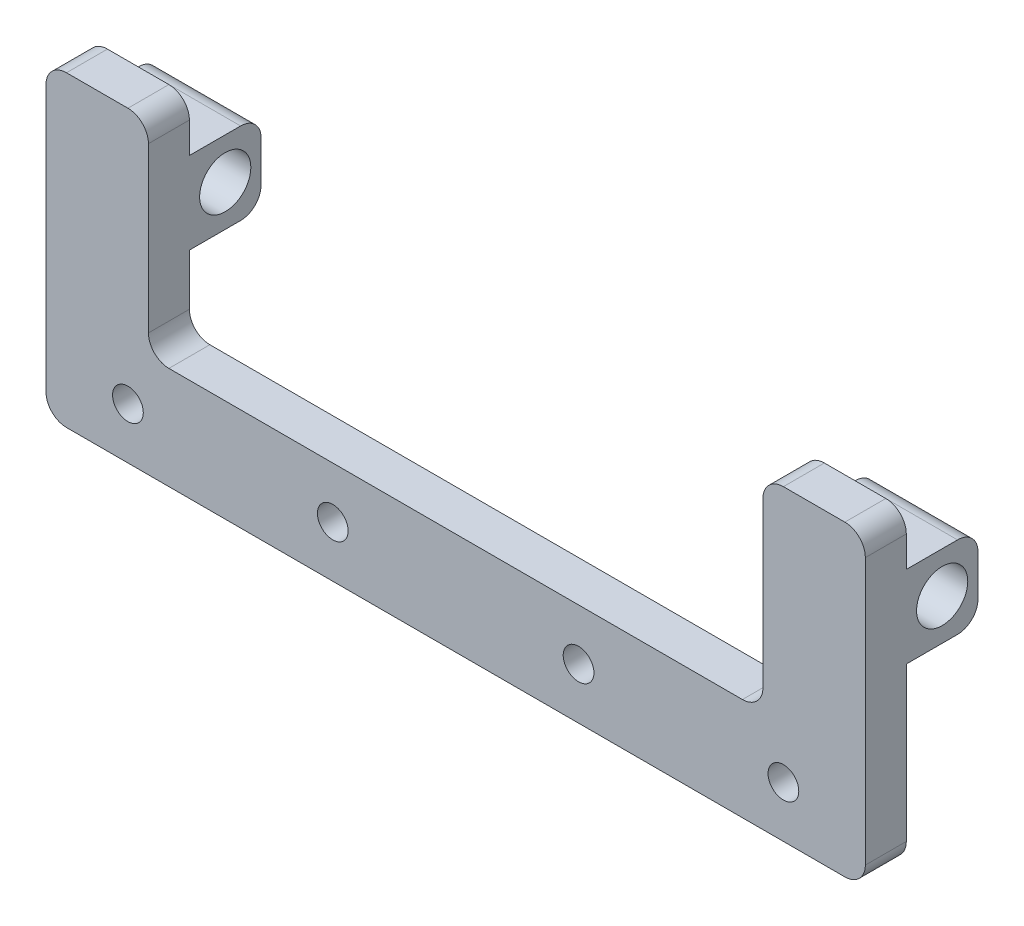
ISO-10303-21;
HEADER;
FILE_DESCRIPTION(('STEP AP214'),'2;1');
FILE_NAME('part.step','',(''),(''),'','','');
FILE_SCHEMA(('AUTOMOTIVE_DESIGN { 1 0 10303 214 1 1 1 1 }'));
ENDSEC;
DATA;
#1=APPLICATION_CONTEXT('core data for automotive mechanical design processes');
#2=APPLICATION_PROTOCOL_DEFINITION('international standard','automotive_design',2000,#1);
#3=PRODUCT_CONTEXT('',#1,'mechanical');
#4=PRODUCT('Part','Part','',(#3));
#5=PRODUCT_RELATED_PRODUCT_CATEGORY('part','',(#4));
#6=PRODUCT_DEFINITION_FORMATION('','',#4);
#7=PRODUCT_DEFINITION_CONTEXT('part definition',#1,'design');
#8=PRODUCT_DEFINITION('design','',#6,#7);
#9=PRODUCT_DEFINITION_SHAPE('','',#8);
#10=(LENGTH_UNIT() NAMED_UNIT(*) SI_UNIT(.MILLI.,.METRE.));
#11=(NAMED_UNIT(*) PLANE_ANGLE_UNIT() SI_UNIT($,.RADIAN.));
#12=(NAMED_UNIT(*) SI_UNIT($,.STERADIAN.) SOLID_ANGLE_UNIT());
#13=UNCERTAINTY_MEASURE_WITH_UNIT(LENGTH_MEASURE(1.E-05),#10,'distance_accuracy_value','');
#14=(GEOMETRIC_REPRESENTATION_CONTEXT(3) GLOBAL_UNCERTAINTY_ASSIGNED_CONTEXT((#13)) GLOBAL_UNIT_ASSIGNED_CONTEXT((#10,
#11,#12)) REPRESENTATION_CONTEXT('',''));
#15=CARTESIAN_POINT('',(0.,0.,0.));
#16=DIRECTION('',(0.,0.,1.));
#17=DIRECTION('',(1.,0.,0.));
#18=AXIS2_PLACEMENT_3D('',#15,#16,#17);
#19=CARTESIAN_POINT('',(0.,0.,0.));
#20=DIRECTION('',(0.,0.,-1.));
#21=DIRECTION('',(-1.,0.,0.));
#22=AXIS2_PLACEMENT_3D('',#19,#20,#21);
#23=PLANE('',#22);
#24=CARTESIAN_POINT('',(38.,18.,0.));
#25=DIRECTION('',(0.,0.,-1.));
#26=DIRECTION('',(-1.,0.,0.));
#27=AXIS2_PLACEMENT_3D('',#24,#25,#26);
#28=CIRCLE('',#27,2.);
#29=CARTESIAN_POINT('',(38.,20.,0.));
#30=VERTEX_POINT('',#29);
#31=CARTESIAN_POINT('',(40.,18.,0.));
#32=VERTEX_POINT('',#31);
#33=EDGE_CURVE('E333',#30,#32,#28,.T.);
#34=ORIENTED_EDGE('',*,*,#33,.T.);
#35=DIRECTION('',(0.,1.,0.));
#36=VECTOR('',#35,1.);
#37=CARTESIAN_POINT('',(40.,0.,0.));
#38=LINE('',#37,#36);
#39=CARTESIAN_POINT('',(40.,15.,0.));
#40=VERTEX_POINT('',#39);
#41=EDGE_CURVE('E211',#32,#40,#38,.F.);
#42=ORIENTED_EDGE('',*,*,#41,.T.);
#43=DIRECTION('',(1.,0.,0.));
#44=VECTOR('',#43,1.);
#45=CARTESIAN_POINT('',(0.,15.,0.));
#46=LINE('',#45,#44);
#47=CARTESIAN_POINT('',(30.,15.,0.));
#48=VERTEX_POINT('',#47);
#49=EDGE_CURVE('E205',#40,#48,#46,.F.);
#50=ORIENTED_EDGE('',*,*,#49,.T.);
#51=DIRECTION('',(0.,1.,0.));
#52=VECTOR('',#51,1.);
#53=CARTESIAN_POINT('',(30.,0.,0.));
#54=LINE('',#53,#52);
#55=CARTESIAN_POINT('',(30.,18.,0.));
#56=VERTEX_POINT('',#55);
#57=EDGE_CURVE('E208',#48,#56,#54,.T.);
#58=ORIENTED_EDGE('',*,*,#57,.T.);
#59=CARTESIAN_POINT('',(32.,18.,0.));
#60=DIRECTION('',(0.,0.,-1.));
#61=DIRECTION('',(-1.,0.,0.));
#62=AXIS2_PLACEMENT_3D('',#59,#60,#61);
#63=CIRCLE('',#62,2.);
#64=CARTESIAN_POINT('',(32.,20.,0.));
#65=VERTEX_POINT('',#64);
#66=EDGE_CURVE('E337',#56,#65,#63,.T.);
#67=ORIENTED_EDGE('',*,*,#66,.T.);
#68=DIRECTION('',(1.,0.,0.));
#69=VECTOR('',#68,1.);
#70=CARTESIAN_POINT('',(0.,20.,0.));
#71=LINE('',#70,#69);
#72=EDGE_CURVE('E235',#65,#30,#71,.T.);
#73=ORIENTED_EDGE('',*,*,#72,.T.);
#74=EDGE_LOOP('',(#34,#42,#50,#58,#67,#73));
#75=FACE_BOUND('',#74,.T.);
#76=ADVANCED_FACE('F17',(#75),#23,.T.);
#77=CARTESIAN_POINT('',(0.,15.,0.));
#78=DIRECTION('',(0.,1.,0.));
#79=DIRECTION('',(0.,0.,1.));
#80=AXIS2_PLACEMENT_3D('',#77,#78,#79);
#81=PLANE('',#80);
#82=ORIENTED_EDGE('',*,*,#49,.F.);
#83=DIRECTION('',(0.,0.,-1.));
#84=VECTOR('',#83,1.);
#85=CARTESIAN_POINT('',(40.,15.,0.));
#86=LINE('',#85,#84);
#87=CARTESIAN_POINT('',(40.,15.,-5.));
#88=VERTEX_POINT('',#87);
#89=EDGE_CURVE('E332',#40,#88,#86,.T.);
#90=ORIENTED_EDGE('',*,*,#89,.T.);
#91=DIRECTION('',(-1.,0.,0.));
#92=VECTOR('',#91,1.);
#93=CARTESIAN_POINT('',(35.,15.,-5.));
#94=LINE('',#93,#92);
#95=CARTESIAN_POINT('',(30.,15.,-4.99999999999999));
#96=VERTEX_POINT('',#95);
#97=EDGE_CURVE('E214',#88,#96,#94,.T.);
#98=ORIENTED_EDGE('',*,*,#97,.T.);
#99=DIRECTION('',(0.,0.,1.));
#100=VECTOR('',#99,1.);
#101=CARTESIAN_POINT('',(30.,15.,0.));
#102=LINE('',#101,#100);
#103=EDGE_CURVE('E217',#96,#48,#102,.T.);
#104=ORIENTED_EDGE('',*,*,#103,.T.);
#105=EDGE_LOOP('',(#82,#90,#98,#104));
#106=FACE_BOUND('',#105,.T.);
#107=ADVANCED_FACE('F218',(#106),#81,.T.);
#108=CARTESIAN_POINT('',(40.,13.,-5.));
#109=DIRECTION('',(-1.,0.,0.));
#110=DIRECTION('',(0.,0.,1.));
#111=AXIS2_PLACEMENT_3D('',#108,#109,#110);
#112=CYLINDRICAL_SURFACE('',#111,2.);
#113=CARTESIAN_POINT('',(40.,13.,-5.));
#114=DIRECTION('',(-1.,0.,0.));
#115=DIRECTION('',(0.,0.,1.));
#116=AXIS2_PLACEMENT_3D('',#113,#114,#115);
#117=CIRCLE('',#116,2.);
#118=CARTESIAN_POINT('',(40.,13.,-7.));
#119=VERTEX_POINT('',#118);
#120=EDGE_CURVE('E330',#88,#119,#117,.T.);
#121=ORIENTED_EDGE('',*,*,#120,.T.);
#122=DIRECTION('',(1.,0.,0.));
#123=VECTOR('',#122,1.);
#124=CARTESIAN_POINT('',(0.,13.,-7.));
#125=LINE('',#124,#123);
#126=CARTESIAN_POINT('',(30.,13.,-7.));
#127=VERTEX_POINT('',#126);
#128=EDGE_CURVE('E400',#119,#127,#125,.F.);
#129=ORIENTED_EDGE('',*,*,#128,.T.);
#130=CARTESIAN_POINT('',(30.,13.,-4.99999999999998));
#131=DIRECTION('',(-1.,0.,0.));
#132=DIRECTION('',(0.,0.,1.));
#133=AXIS2_PLACEMENT_3D('',#130,#131,#132);
#134=CIRCLE('',#133,2.);
#135=EDGE_CURVE('E223',#127,#96,#134,.F.);
#136=ORIENTED_EDGE('',*,*,#135,.T.);
#137=ORIENTED_EDGE('',*,*,#97,.F.);
#138=EDGE_LOOP('',(#121,#129,#136,#137));
#139=FACE_BOUND('',#138,.T.);
#140=ADVANCED_FACE('F510',(#139),#112,.T.);
#141=CARTESIAN_POINT('',(0.,0.,-7.));
#142=DIRECTION('',(0.,0.,1.));
#143=DIRECTION('',(1.,0.,0.));
#144=AXIS2_PLACEMENT_3D('',#141,#142,#143);
#145=PLANE('',#144);
#146=DIRECTION('',(0.,1.,0.));
#147=VECTOR('',#146,1.);
#148=CARTESIAN_POINT('',(40.,0.,-7.));
#149=LINE('',#148,#147);
#150=CARTESIAN_POINT('',(40.,9.,-7.));
#151=VERTEX_POINT('',#150);
#152=EDGE_CURVE('E329',#119,#151,#149,.F.);
#153=ORIENTED_EDGE('',*,*,#152,.T.);
#154=DIRECTION('',(-1.,0.,0.));
#155=VECTOR('',#154,1.);
#156=CARTESIAN_POINT('',(35.,9.,-7.));
#157=LINE('',#156,#155);
#158=CARTESIAN_POINT('',(30.,9.,-7.));
#159=VERTEX_POINT('',#158);
#160=EDGE_CURVE('E396',#151,#159,#157,.T.);
#161=ORIENTED_EDGE('',*,*,#160,.T.);
#162=DIRECTION('',(0.,1.,0.));
#163=VECTOR('',#162,1.);
#164=CARTESIAN_POINT('',(30.,0.,-7.));
#165=LINE('',#164,#163);
#166=EDGE_CURVE('E341',#159,#127,#165,.T.);
#167=ORIENTED_EDGE('',*,*,#166,.T.);
#168=ORIENTED_EDGE('',*,*,#128,.F.);
#169=EDGE_LOOP('',(#153,#161,#167,#168));
#170=FACE_BOUND('',#169,.T.);
#171=ADVANCED_FACE('F489',(#170),#145,.F.);
#172=CARTESIAN_POINT('',(30.,9.,-5.));
#173=DIRECTION('',(1.,0.,0.));
#174=DIRECTION('',(0.,0.,-1.));
#175=AXIS2_PLACEMENT_3D('',#172,#173,#174);
#176=CYLINDRICAL_SURFACE('',#175,2.);
#177=CARTESIAN_POINT('',(30.,9.,-5.));
#178=DIRECTION('',(1.,0.,0.));
#179=DIRECTION('',(0.,0.,-1.));
#180=AXIS2_PLACEMENT_3D('',#177,#178,#179);
#181=CIRCLE('',#180,2.);
#182=CARTESIAN_POINT('',(30.,7.,-5.));
#183=VERTEX_POINT('',#182);
#184=EDGE_CURVE('E342',#183,#159,#181,.T.);
#185=ORIENTED_EDGE('',*,*,#184,.T.);
#186=ORIENTED_EDGE('',*,*,#160,.F.);
#187=CARTESIAN_POINT('',(40.,9.,-5.00000000000001));
#188=DIRECTION('',(1.,0.,0.));
#189=DIRECTION('',(0.,0.,-1.));
#190=AXIS2_PLACEMENT_3D('',#187,#188,#189);
#191=CIRCLE('',#190,2.);
#192=CARTESIAN_POINT('',(40.,7.,-5.));
#193=VERTEX_POINT('',#192);
#194=EDGE_CURVE('E327',#151,#193,#191,.F.);
#195=ORIENTED_EDGE('',*,*,#194,.T.);
#196=DIRECTION('',(1.,0.,0.));
#197=VECTOR('',#196,1.);
#198=CARTESIAN_POINT('',(0.,7.,-5.));
#199=LINE('',#198,#197);
#200=EDGE_CURVE('E382',#193,#183,#199,.F.);
#201=ORIENTED_EDGE('',*,*,#200,.T.);
#202=EDGE_LOOP('',(#185,#186,#195,#201));
#203=FACE_BOUND('',#202,.T.);
#204=ADVANCED_FACE('F494',(#203),#176,.T.);
#205=CARTESIAN_POINT('',(30.,11.,-3.5));
#206=DIRECTION('',(1.,0.,0.));
#207=DIRECTION('',(0.,0.,-1.));
#208=AXIS2_PLACEMENT_3D('',#205,#206,#207);
#209=CYLINDRICAL_SURFACE('',#208,2.50000000047519);
#210=CARTESIAN_POINT('',(40.,11.,-3.50000000000001));
#211=DIRECTION('',(1.,0.,0.));
#212=DIRECTION('',(0.,0.,-1.));
#213=AXIS2_PLACEMENT_3D('',#210,#211,#212);
#214=CIRCLE('',#213,2.50000000047519);
#215=CARTESIAN_POINT('',(40.,11.,-6.0000000004752));
#216=VERTEX_POINT('',#215);
#217=EDGE_CURVE('E322',#216,#216,#214,.T.);
#218=ORIENTED_EDGE('',*,*,#217,.T.);
#219=EDGE_LOOP('',(#218));
#220=FACE_BOUND('',#219,.T.);
#221=CARTESIAN_POINT('',(30.,11.,-3.5));
#222=DIRECTION('',(1.,0.,0.));
#223=DIRECTION('',(0.,0.,-1.));
#224=AXIS2_PLACEMENT_3D('',#221,#222,#223);
#225=CIRCLE('',#224,2.50000000047519);
#226=CARTESIAN_POINT('',(30.,11.,-6.00000000047519));
#227=VERTEX_POINT('',#226);
#228=EDGE_CURVE('E229',#227,#227,#225,.F.);
#229=ORIENTED_EDGE('',*,*,#228,.T.);
#230=EDGE_LOOP('',(#229));
#231=FACE_BOUND('',#230,.T.);
#232=ADVANCED_FACE('F638',(#220,#231),#209,.F.);
#233=CARTESIAN_POINT('',(-30.,9.,-5.));
#234=DIRECTION('',(-1.,0.,0.));
#235=DIRECTION('',(0.,-1.,0.));
#236=AXIS2_PLACEMENT_3D('',#233,#234,#235);
#237=CYLINDRICAL_SURFACE('',#236,2.);
#238=CARTESIAN_POINT('',(-30.,9.,-5.));
#239=DIRECTION('',(-1.,0.,0.));
#240=DIRECTION('',(0.,-1.,0.));
#241=AXIS2_PLACEMENT_3D('',#238,#239,#240);
#242=CIRCLE('',#241,2.);
#243=CARTESIAN_POINT('',(-30.,9.,-7.));
#244=VERTEX_POINT('',#243);
#245=CARTESIAN_POINT('',(-30.,7.,-5.));
#246=VERTEX_POINT('',#245);
#247=EDGE_CURVE('E351',#244,#246,#242,.T.);
#248=ORIENTED_EDGE('',*,*,#247,.T.);
#249=DIRECTION('',(1.,0.,0.));
#250=VECTOR('',#249,1.);
#251=CARTESIAN_POINT('',(0.,7.,-5.));
#252=LINE('',#251,#250);
#253=CARTESIAN_POINT('',(-40.,7.,-5.));
#254=VERTEX_POINT('',#253);
#255=EDGE_CURVE('E387',#246,#254,#252,.F.);
#256=ORIENTED_EDGE('',*,*,#255,.T.);
#257=CARTESIAN_POINT('',(-40.,8.99999999999999,-5.));
#258=DIRECTION('',(-1.,0.,0.));
#259=DIRECTION('',(0.,-1.,0.));
#260=AXIS2_PLACEMENT_3D('',#257,#258,#259);
#261=CIRCLE('',#260,2.);
#262=CARTESIAN_POINT('',(-40.,9.,-7.));
#263=VERTEX_POINT('',#262);
#264=EDGE_CURVE('E319',#254,#263,#261,.F.);
#265=ORIENTED_EDGE('',*,*,#264,.T.);
#266=DIRECTION('',(1.,0.,0.));
#267=VECTOR('',#266,1.);
#268=CARTESIAN_POINT('',(0.,9.,-7.));
#269=LINE('',#268,#267);
#270=EDGE_CURVE('E394',#263,#244,#269,.T.);
#271=ORIENTED_EDGE('',*,*,#270,.T.);
#272=EDGE_LOOP('',(#248,#256,#265,#271));
#273=FACE_BOUND('',#272,.T.);
#274=ADVANCED_FACE('F636',(#273),#237,.T.);
#275=CARTESIAN_POINT('',(0.,0.,-7.));
#276=DIRECTION('',(0.,0.,1.));
#277=DIRECTION('',(1.,0.,0.));
#278=AXIS2_PLACEMENT_3D('',#275,#276,#277);
#279=PLANE('',#278);
#280=DIRECTION('',(0.,1.,0.));
#281=VECTOR('',#280,1.);
#282=CARTESIAN_POINT('',(-40.,0.,-7.));
#283=LINE('',#282,#281);
#284=CARTESIAN_POINT('',(-40.,13.,-7.));
#285=VERTEX_POINT('',#284);
#286=EDGE_CURVE('E318',#263,#285,#283,.T.);
#287=ORIENTED_EDGE('',*,*,#286,.T.);
#288=DIRECTION('',(1.,0.,0.));
#289=VECTOR('',#288,1.);
#290=CARTESIAN_POINT('',(-35.,13.,-7.));
#291=LINE('',#290,#289);
#292=CARTESIAN_POINT('',(-30.,13.,-7.));
#293=VERTEX_POINT('',#292);
#294=EDGE_CURVE('E392',#285,#293,#291,.T.);
#295=ORIENTED_EDGE('',*,*,#294,.T.);
#296=DIRECTION('',(0.,1.,0.));
#297=VECTOR('',#296,1.);
#298=CARTESIAN_POINT('',(-30.,0.,-7.));
#299=LINE('',#298,#297);
#300=EDGE_CURVE('E352',#293,#244,#299,.F.);
#301=ORIENTED_EDGE('',*,*,#300,.T.);
#302=ORIENTED_EDGE('',*,*,#270,.F.);
#303=EDGE_LOOP('',(#287,#295,#301,#302));
#304=FACE_BOUND('',#303,.T.);
#305=ADVANCED_FACE('F631',(#304),#279,.F.);
#306=CARTESIAN_POINT('',(-40.,13.,-5.));
#307=DIRECTION('',(1.,0.,0.));
#308=DIRECTION('',(0.,1.,0.));
#309=AXIS2_PLACEMENT_3D('',#306,#307,#308);
#310=CYLINDRICAL_SURFACE('',#309,2.);
#311=CARTESIAN_POINT('',(-40.,13.,-5.));
#312=DIRECTION('',(1.,0.,0.));
#313=DIRECTION('',(0.,1.,0.));
#314=AXIS2_PLACEMENT_3D('',#311,#312,#313);
#315=CIRCLE('',#314,2.);
#316=CARTESIAN_POINT('',(-40.,15.,-5.));
#317=VERTEX_POINT('',#316);
#318=EDGE_CURVE('E315',#285,#317,#315,.T.);
#319=ORIENTED_EDGE('',*,*,#318,.T.);
#320=DIRECTION('',(1.,0.,0.));
#321=VECTOR('',#320,1.);
#322=CARTESIAN_POINT('',(0.,15.,-5.));
#323=LINE('',#322,#321);
#324=CARTESIAN_POINT('',(-30.,15.,-5.));
#325=VERTEX_POINT('',#324);
#326=EDGE_CURVE('E388',#317,#325,#323,.T.);
#327=ORIENTED_EDGE('',*,*,#326,.T.);
#328=CARTESIAN_POINT('',(-30.,13.,-5.));
#329=DIRECTION('',(1.,0.,0.));
#330=DIRECTION('',(0.,1.,0.));
#331=AXIS2_PLACEMENT_3D('',#328,#329,#330);
#332=CIRCLE('',#331,2.);
#333=EDGE_CURVE('E353',#325,#293,#332,.F.);
#334=ORIENTED_EDGE('',*,*,#333,.T.);
#335=ORIENTED_EDGE('',*,*,#294,.F.);
#336=EDGE_LOOP('',(#319,#327,#334,#335));
#337=FACE_BOUND('',#336,.T.);
#338=ADVANCED_FACE('F633',(#337),#310,.T.);
#339=CARTESIAN_POINT('',(0.,15.,0.));
#340=DIRECTION('',(0.,1.,0.));
#341=DIRECTION('',(0.,0.,1.));
#342=AXIS2_PLACEMENT_3D('',#339,#340,#341);
#343=PLANE('',#342);
#344=DIRECTION('',(-1.,0.,0.));
#345=VECTOR('',#344,1.);
#346=CARTESIAN_POINT('',(0.,15.,0.));
#347=LINE('',#346,#345);
#348=CARTESIAN_POINT('',(-40.,15.,0.));
#349=VERTEX_POINT('',#348);
#350=CARTESIAN_POINT('',(-30.,15.,0.));
#351=VERTEX_POINT('',#350);
#352=EDGE_CURVE('E197',#349,#351,#347,.F.);
#353=ORIENTED_EDGE('',*,*,#352,.T.);
#354=DIRECTION('',(0.,0.,-1.));
#355=VECTOR('',#354,1.);
#356=CARTESIAN_POINT('',(-30.,15.,0.));
#357=LINE('',#356,#355);
#358=EDGE_CURVE('E241',#351,#325,#357,.T.);
#359=ORIENTED_EDGE('',*,*,#358,.T.);
#360=ORIENTED_EDGE('',*,*,#326,.F.);
#361=DIRECTION('',(0.,0.,1.));
#362=VECTOR('',#361,1.);
#363=CARTESIAN_POINT('',(-40.,15.,0.));
#364=LINE('',#363,#362);
#365=EDGE_CURVE('E317',#317,#349,#364,.T.);
#366=ORIENTED_EDGE('',*,*,#365,.T.);
#367=EDGE_LOOP('',(#353,#359,#360,#366));
#368=FACE_BOUND('',#367,.T.);
#369=ADVANCED_FACE('F712',(#368),#343,.T.);
#370=CARTESIAN_POINT('',(-40.,11.,-3.5));
#371=DIRECTION('',(1.,0.,0.));
#372=DIRECTION('',(0.,0.,-1.));
#373=AXIS2_PLACEMENT_3D('',#370,#371,#372);
#374=CYLINDRICAL_SURFACE('',#373,2.50000000047519);
#375=CARTESIAN_POINT('',(-40.,11.,-3.5));
#376=DIRECTION('',(1.,0.,0.));
#377=DIRECTION('',(0.,0.,-1.));
#378=AXIS2_PLACEMENT_3D('',#375,#376,#377);
#379=CIRCLE('',#378,2.50000000047519);
#380=CARTESIAN_POINT('',(-40.,11.,-6.00000000047519));
#381=VERTEX_POINT('',#380);
#382=EDGE_CURVE('E311',#381,#381,#379,.F.);
#383=ORIENTED_EDGE('',*,*,#382,.T.);
#384=EDGE_LOOP('',(#383));
#385=FACE_BOUND('',#384,.T.);
#386=CARTESIAN_POINT('',(-30.,11.,-3.49999999999999));
#387=DIRECTION('',(1.,0.,0.));
#388=DIRECTION('',(0.,0.,-1.));
#389=AXIS2_PLACEMENT_3D('',#386,#387,#388);
#390=CIRCLE('',#389,2.50000000047519);
#391=CARTESIAN_POINT('',(-30.,11.,-6.00000000047518));
#392=VERTEX_POINT('',#391);
#393=EDGE_CURVE('E346',#392,#392,#390,.T.);
#394=ORIENTED_EDGE('',*,*,#393,.T.);
#395=EDGE_LOOP('',(#394));
#396=FACE_BOUND('',#395,.T.);
#397=ADVANCED_FACE('F720',(#385,#396),#374,.F.);
#398=CARTESIAN_POINT('',(0.,0.,0.));
#399=DIRECTION('',(0.,0.,-1.));
#400=DIRECTION('',(-1.,0.,0.));
#401=AXIS2_PLACEMENT_3D('',#398,#399,#400);
#402=PLANE('',#401);
#403=CARTESIAN_POINT('',(-32.,18.,0.));
#404=DIRECTION('',(0.,0.,-1.));
#405=DIRECTION('',(-1.,0.,0.));
#406=AXIS2_PLACEMENT_3D('',#403,#404,#405);
#407=CIRCLE('',#406,2.);
#408=CARTESIAN_POINT('',(-32.,20.,0.));
#409=VERTEX_POINT('',#408);
#410=CARTESIAN_POINT('',(-30.,18.,0.));
#411=VERTEX_POINT('',#410);
#412=EDGE_CURVE('E20',#409,#411,#407,.T.);
#413=ORIENTED_EDGE('',*,*,#412,.T.);
#414=DIRECTION('',(0.,1.,0.));
#415=VECTOR('',#414,1.);
#416=CARTESIAN_POINT('',(-30.,0.,0.));
#417=LINE('',#416,#415);
#418=EDGE_CURVE('E239',#411,#351,#417,.F.);
#419=ORIENTED_EDGE('',*,*,#418,.T.);
#420=ORIENTED_EDGE('',*,*,#352,.F.);
#421=DIRECTION('',(0.,1.,0.));
#422=VECTOR('',#421,1.);
#423=CARTESIAN_POINT('',(-40.,0.,0.));
#424=LINE('',#423,#422);
#425=CARTESIAN_POINT('',(-40.,18.,0.));
#426=VERTEX_POINT('',#425);
#427=EDGE_CURVE('E314',#349,#426,#424,.T.);
#428=ORIENTED_EDGE('',*,*,#427,.T.);
#429=CARTESIAN_POINT('',(-38.,18.,0.));
#430=DIRECTION('',(0.,0.,-1.));
#431=DIRECTION('',(-1.,0.,0.));
#432=AXIS2_PLACEMENT_3D('',#429,#430,#431);
#433=CIRCLE('',#432,2.);
#434=CARTESIAN_POINT('',(-38.,20.,0.));
#435=VERTEX_POINT('',#434);
#436=EDGE_CURVE('E307',#426,#435,#433,.T.);
#437=ORIENTED_EDGE('',*,*,#436,.T.);
#438=DIRECTION('',(1.,0.,0.));
#439=VECTOR('',#438,1.);
#440=CARTESIAN_POINT('',(0.,20.,0.));
#441=LINE('',#440,#439);
#442=EDGE_CURVE('E186',#435,#409,#441,.T.);
#443=ORIENTED_EDGE('',*,*,#442,.T.);
#444=EDGE_LOOP('',(#413,#419,#420,#428,#437,#443));
#445=FACE_BOUND('',#444,.T.);
#446=ADVANCED_FACE('F626',(#445),#402,.T.);
#447=CARTESIAN_POINT('',(0.,7.,0.));
#448=DIRECTION('',(0.,-1.,0.));
#449=DIRECTION('',(0.,0.,-1.));
#450=AXIS2_PLACEMENT_3D('',#447,#448,#449);
#451=PLANE('',#450);
#452=DIRECTION('',(-1.,0.,0.));
#453=VECTOR('',#452,1.);
#454=CARTESIAN_POINT('',(0.,7.,0.));
#455=LINE('',#454,#453);
#456=CARTESIAN_POINT('',(-30.,7.,0.));
#457=VERTEX_POINT('',#456);
#458=CARTESIAN_POINT('',(-40.,7.,0.));
#459=VERTEX_POINT('',#458);
#460=EDGE_CURVE('E371',#457,#459,#455,.T.);
#461=ORIENTED_EDGE('',*,*,#460,.T.);
#462=DIRECTION('',(0.,0.,1.));
#463=VECTOR('',#462,1.);
#464=CARTESIAN_POINT('',(-40.,7.,0.));
#465=LINE('',#464,#463);
#466=EDGE_CURVE('E321',#459,#254,#465,.F.);
#467=ORIENTED_EDGE('',*,*,#466,.T.);
#468=ORIENTED_EDGE('',*,*,#255,.F.);
#469=DIRECTION('',(0.,0.,-1.));
#470=VECTOR('',#469,1.);
#471=CARTESIAN_POINT('',(-30.,7.,0.));
#472=LINE('',#471,#470);
#473=EDGE_CURVE('E350',#246,#457,#472,.F.);
#474=ORIENTED_EDGE('',*,*,#473,.T.);
#475=EDGE_LOOP('',(#461,#467,#468,#474));
#476=FACE_BOUND('',#475,.T.);
#477=ADVANCED_FACE('F441',(#476),#451,.T.);
#478=CARTESIAN_POINT('',(0.,7.,0.));
#479=DIRECTION('',(0.,-1.,0.));
#480=DIRECTION('',(0.,0.,-1.));
#481=AXIS2_PLACEMENT_3D('',#478,#479,#480);
#482=PLANE('',#481);
#483=DIRECTION('',(-1.,0.,0.));
#484=VECTOR('',#483,1.);
#485=CARTESIAN_POINT('',(0.,7.,0.));
#486=LINE('',#485,#484);
#487=CARTESIAN_POINT('',(40.,7.,0.));
#488=VERTEX_POINT('',#487);
#489=CARTESIAN_POINT('',(30.,7.,0.));
#490=VERTEX_POINT('',#489);
#491=EDGE_CURVE('E376',#488,#490,#486,.T.);
#492=ORIENTED_EDGE('',*,*,#491,.T.);
#493=DIRECTION('',(0.,0.,1.));
#494=VECTOR('',#493,1.);
#495=CARTESIAN_POINT('',(30.,7.,0.));
#496=LINE('',#495,#494);
#497=EDGE_CURVE('E345',#490,#183,#496,.F.);
#498=ORIENTED_EDGE('',*,*,#497,.T.);
#499=ORIENTED_EDGE('',*,*,#200,.F.);
#500=DIRECTION('',(0.,0.,-1.));
#501=VECTOR('',#500,1.);
#502=CARTESIAN_POINT('',(40.,7.,0.));
#503=LINE('',#502,#501);
#504=EDGE_CURVE('E326',#193,#488,#503,.F.);
#505=ORIENTED_EDGE('',*,*,#504,.T.);
#506=EDGE_LOOP('',(#492,#498,#499,#505));
#507=FACE_BOUND('',#506,.T.);
#508=ADVANCED_FACE('F504',(#507),#482,.T.);
#509=CARTESIAN_POINT('',(0.,20.,0.));
#510=DIRECTION('',(0.,1.,0.));
#511=DIRECTION('',(0.,0.,1.));
#512=AXIS2_PLACEMENT_3D('',#509,#510,#511);
#513=PLANE('',#512);
#514=DIRECTION('',(0.,0.,-1.));
#515=VECTOR('',#514,1.);
#516=CARTESIAN_POINT('',(-32.,20.,2.));
#517=LINE('',#516,#515);
#518=CARTESIAN_POINT('',(-32.,20.,4.));
#519=VERTEX_POINT('',#518);
#520=EDGE_CURVE('E369',#519,#409,#517,.T.);
#521=ORIENTED_EDGE('',*,*,#520,.T.);
#522=ORIENTED_EDGE('',*,*,#442,.F.);
#523=DIRECTION('',(0.,0.,1.));
#524=VECTOR('',#523,1.);
#525=CARTESIAN_POINT('',(-38.,20.,2.));
#526=LINE('',#525,#524);
#527=CARTESIAN_POINT('',(-38.,20.,4.));
#528=VERTEX_POINT('',#527);
#529=EDGE_CURVE('E309',#435,#528,#526,.T.);
#530=ORIENTED_EDGE('',*,*,#529,.T.);
#531=DIRECTION('',(-1.,0.,0.));
#532=VECTOR('',#531,1.);
#533=CARTESIAN_POINT('',(0.,20.,4.));
#534=LINE('',#533,#532);
#535=EDGE_CURVE('E279',#528,#519,#534,.F.);
#536=ORIENTED_EDGE('',*,*,#535,.T.);
#537=EDGE_LOOP('',(#521,#522,#530,#536));
#538=FACE_BOUND('',#537,.T.);
#539=ADVANCED_FACE('F754',(#538),#513,.T.);
#540=CARTESIAN_POINT('',(-32.,18.,4.));
#541=DIRECTION('',(0.,0.,-1.));
#542=DIRECTION('',(-1.,0.,0.));
#543=AXIS2_PLACEMENT_3D('',#540,#541,#542);
#544=CYLINDRICAL_SURFACE('',#543,2.);
#545=ORIENTED_EDGE('',*,*,#412,.F.);
#546=ORIENTED_EDGE('',*,*,#520,.F.);
#547=CARTESIAN_POINT('',(-32.,18.,4.));
#548=DIRECTION('',(0.,0.,-1.));
#549=DIRECTION('',(-1.,0.,0.));
#550=AXIS2_PLACEMENT_3D('',#547,#548,#549);
#551=CIRCLE('',#550,2.);
#552=CARTESIAN_POINT('',(-30.,18.,4.));
#553=VERTEX_POINT('',#552);
#554=EDGE_CURVE('E277',#519,#553,#551,.T.);
#555=ORIENTED_EDGE('',*,*,#554,.T.);
#556=DIRECTION('',(0.,0.,-1.));
#557=VECTOR('',#556,1.);
#558=CARTESIAN_POINT('',(-30.,18.,0.));
#559=LINE('',#558,#557);
#560=EDGE_CURVE('E242',#553,#411,#559,.T.);
#561=ORIENTED_EDGE('',*,*,#560,.T.);
#562=EDGE_LOOP('',(#545,#546,#555,#561));
#563=FACE_BOUND('',#562,.T.);
#564=ADVANCED_FACE('F763',(#563),#544,.T.);
#565=CARTESIAN_POINT('',(-30.,0.,0.));
#566=DIRECTION('',(1.,0.,0.));
#567=DIRECTION('',(0.,0.,-1.));
#568=AXIS2_PLACEMENT_3D('',#565,#566,#567);
#569=PLANE('',#568);
#570=ORIENTED_EDGE('',*,*,#393,.F.);
#571=EDGE_LOOP('',(#570));
#572=FACE_BOUND('',#571,.T.);
#573=DIRECTION('',(0.,0.,1.));
#574=VECTOR('',#573,1.);
#575=CARTESIAN_POINT('',(-30.,2.,2.));
#576=LINE('',#575,#574);
#577=CARTESIAN_POINT('',(-30.,2.,4.));
#578=VERTEX_POINT('',#577);
#579=CARTESIAN_POINT('',(-30.,2.,0.));
#580=VERTEX_POINT('',#579);
#581=EDGE_CURVE('E349',#578,#580,#576,.F.);
#582=ORIENTED_EDGE('',*,*,#581,.T.);
#583=DIRECTION('',(0.,1.,0.));
#584=VECTOR('',#583,1.);
#585=CARTESIAN_POINT('',(-30.,0.,0.));
#586=LINE('',#585,#584);
#587=EDGE_CURVE('E289',#580,#457,#586,.T.);
#588=ORIENTED_EDGE('',*,*,#587,.T.);
#589=ORIENTED_EDGE('',*,*,#473,.F.);
#590=ORIENTED_EDGE('',*,*,#247,.F.);
#591=ORIENTED_EDGE('',*,*,#300,.F.);
#592=ORIENTED_EDGE('',*,*,#333,.F.);
#593=ORIENTED_EDGE('',*,*,#358,.F.);
#594=ORIENTED_EDGE('',*,*,#418,.F.);
#595=ORIENTED_EDGE('',*,*,#560,.F.);
#596=DIRECTION('',(0.,1.,0.));
#597=VECTOR('',#596,1.);
#598=CARTESIAN_POINT('',(-30.,0.,4.));
#599=LINE('',#598,#597);
#600=EDGE_CURVE('E276',#553,#578,#599,.F.);
#601=ORIENTED_EDGE('',*,*,#600,.T.);
#602=EDGE_LOOP('',(#582,#588,#589,#590,#591,#592,#593,#594,#595,#601));
#603=FACE_BOUND('',#602,.T.);
#604=ADVANCED_FACE('F448',(#572,#603),#569,.T.);
#605=CARTESIAN_POINT('',(-28.,2.,4.));
#606=DIRECTION('',(0.,0.,-1.));
#607=DIRECTION('',(-1.,0.,0.));
#608=AXIS2_PLACEMENT_3D('',#605,#606,#607);
#609=CYLINDRICAL_SURFACE('',#608,2.);
#610=ORIENTED_EDGE('',*,*,#581,.F.);
#611=CARTESIAN_POINT('',(-28.,2.,4.));
#612=DIRECTION('',(0.,0.,-1.));
#613=DIRECTION('',(-1.,0.,0.));
#614=AXIS2_PLACEMENT_3D('',#611,#612,#613);
#615=CIRCLE('',#614,2.);
#616=CARTESIAN_POINT('',(-28.,0.,4.));
#617=VERTEX_POINT('',#616);
#618=EDGE_CURVE('E274',#578,#617,#615,.F.);
#619=ORIENTED_EDGE('',*,*,#618,.T.);
#620=DIRECTION('',(0.,0.,1.));
#621=VECTOR('',#620,1.);
#622=CARTESIAN_POINT('',(-28.,0.,0.));
#623=LINE('',#622,#621);
#624=CARTESIAN_POINT('',(-28.,0.,0.));
#625=VERTEX_POINT('',#624);
#626=EDGE_CURVE('E432',#617,#625,#623,.F.);
#627=ORIENTED_EDGE('',*,*,#626,.T.);
#628=CARTESIAN_POINT('',(-28.,2.,0.));
#629=DIRECTION('',(0.,0.,-1.));
#630=DIRECTION('',(-1.,0.,0.));
#631=AXIS2_PLACEMENT_3D('',#628,#629,#630);
#632=CIRCLE('',#631,2.);
#633=EDGE_CURVE('E290',#625,#580,#632,.T.);
#634=ORIENTED_EDGE('',*,*,#633,.T.);
#635=EDGE_LOOP('',(#610,#619,#627,#634));
#636=FACE_BOUND('',#635,.T.);
#637=ADVANCED_FACE('F782',(#636),#609,.F.);
#638=CARTESIAN_POINT('',(0.,0.,0.));
#639=DIRECTION('',(0.,1.,0.));
#640=DIRECTION('',(0.,0.,1.));
#641=AXIS2_PLACEMENT_3D('',#638,#639,#640);
#642=PLANE('',#641);
#643=ORIENTED_EDGE('',*,*,#626,.F.);
#644=DIRECTION('',(-1.,0.,0.));
#645=VECTOR('',#644,1.);
#646=CARTESIAN_POINT('',(0.,0.,4.));
#647=LINE('',#646,#645);
#648=CARTESIAN_POINT('',(28.,0.,4.));
#649=VERTEX_POINT('',#648);
#650=EDGE_CURVE('E273',#617,#649,#647,.F.);
#651=ORIENTED_EDGE('',*,*,#650,.T.);
#652=DIRECTION('',(0.,0.,1.));
#653=VECTOR('',#652,1.);
#654=CARTESIAN_POINT('',(28.,0.,2.));
#655=LINE('',#654,#653);
#656=CARTESIAN_POINT('',(28.,0.,0.));
#657=VERTEX_POINT('',#656);
#658=EDGE_CURVE('E430',#649,#657,#655,.F.);
#659=ORIENTED_EDGE('',*,*,#658,.T.);
#660=DIRECTION('',(-1.,0.,0.));
#661=VECTOR('',#660,1.);
#662=CARTESIAN_POINT('',(0.,0.,0.));
#663=LINE('',#662,#661);
#664=EDGE_CURVE('E293',#657,#625,#663,.T.);
#665=ORIENTED_EDGE('',*,*,#664,.T.);
#666=EDGE_LOOP('',(#643,#651,#659,#665));
#667=FACE_BOUND('',#666,.T.);
#668=ADVANCED_FACE('F792',(#667),#642,.T.);
#669=CARTESIAN_POINT('',(28.,2.,4.));
#670=DIRECTION('',(0.,0.,-1.));
#671=DIRECTION('',(-1.,0.,0.));
#672=AXIS2_PLACEMENT_3D('',#669,#670,#671);
#673=CYLINDRICAL_SURFACE('',#672,2.);
#674=ORIENTED_EDGE('',*,*,#658,.F.);
#675=CARTESIAN_POINT('',(28.,2.,4.));
#676=DIRECTION('',(0.,0.,-1.));
#677=DIRECTION('',(-1.,0.,0.));
#678=AXIS2_PLACEMENT_3D('',#675,#676,#677);
#679=CIRCLE('',#678,2.);
#680=CARTESIAN_POINT('',(30.,2.,4.));
#681=VERTEX_POINT('',#680);
#682=EDGE_CURVE('E271',#649,#681,#679,.F.);
#683=ORIENTED_EDGE('',*,*,#682,.T.);
#684=DIRECTION('',(0.,0.,1.));
#685=VECTOR('',#684,1.);
#686=CARTESIAN_POINT('',(30.,2.,0.));
#687=LINE('',#686,#685);
#688=CARTESIAN_POINT('',(30.,2.,0.));
#689=VERTEX_POINT('',#688);
#690=EDGE_CURVE('E426',#681,#689,#687,.F.);
#691=ORIENTED_EDGE('',*,*,#690,.T.);
#692=CARTESIAN_POINT('',(28.,2.,0.));
#693=DIRECTION('',(0.,0.,-1.));
#694=DIRECTION('',(-1.,0.,0.));
#695=AXIS2_PLACEMENT_3D('',#692,#693,#694);
#696=CIRCLE('',#695,2.);
#697=EDGE_CURVE('E294',#689,#657,#696,.T.);
#698=ORIENTED_EDGE('',*,*,#697,.T.);
#699=EDGE_LOOP('',(#674,#683,#691,#698));
#700=FACE_BOUND('',#699,.T.);
#701=ADVANCED_FACE('F542',(#700),#673,.F.);
#702=CARTESIAN_POINT('',(30.,0.,0.));
#703=DIRECTION('',(-1.,0.,0.));
#704=DIRECTION('',(0.,0.,1.));
#705=AXIS2_PLACEMENT_3D('',#702,#703,#704);
#706=PLANE('',#705);
#707=ORIENTED_EDGE('',*,*,#228,.F.);
#708=EDGE_LOOP('',(#707));
#709=FACE_BOUND('',#708,.T.);
#710=ORIENTED_EDGE('',*,*,#103,.F.);
#711=ORIENTED_EDGE('',*,*,#135,.F.);
#712=ORIENTED_EDGE('',*,*,#166,.F.);
#713=ORIENTED_EDGE('',*,*,#184,.F.);
#714=ORIENTED_EDGE('',*,*,#497,.F.);
#715=DIRECTION('',(0.,1.,0.));
#716=VECTOR('',#715,1.);
#717=CARTESIAN_POINT('',(30.,0.,0.));
#718=LINE('',#717,#716);
#719=EDGE_CURVE('E297',#490,#689,#718,.F.);
#720=ORIENTED_EDGE('',*,*,#719,.T.);
#721=ORIENTED_EDGE('',*,*,#690,.F.);
#722=DIRECTION('',(0.,1.,0.));
#723=VECTOR('',#722,1.);
#724=CARTESIAN_POINT('',(30.,0.,4.));
#725=LINE('',#724,#723);
#726=CARTESIAN_POINT('',(30.,18.,4.));
#727=VERTEX_POINT('',#726);
#728=EDGE_CURVE('E270',#681,#727,#725,.T.);
#729=ORIENTED_EDGE('',*,*,#728,.T.);
#730=DIRECTION('',(0.,0.,-1.));
#731=VECTOR('',#730,1.);
#732=CARTESIAN_POINT('',(30.,18.,2.));
#733=LINE('',#732,#731);
#734=EDGE_CURVE('E227',#727,#56,#733,.T.);
#735=ORIENTED_EDGE('',*,*,#734,.T.);
#736=ORIENTED_EDGE('',*,*,#57,.F.);
#737=EDGE_LOOP('',(#710,#711,#712,#713,#714,#720,#721,#729,#735,#736));
#738=FACE_BOUND('',#737,.T.);
#739=ADVANCED_FACE('F225',(#709,#738),#706,.T.);
#740=CARTESIAN_POINT('',(32.,18.,4.));
#741=DIRECTION('',(0.,0.,-1.));
#742=DIRECTION('',(-1.,0.,0.));
#743=AXIS2_PLACEMENT_3D('',#740,#741,#742);
#744=CYLINDRICAL_SURFACE('',#743,2.);
#745=ORIENTED_EDGE('',*,*,#66,.F.);
#746=ORIENTED_EDGE('',*,*,#734,.F.);
#747=CARTESIAN_POINT('',(32.,18.,4.));
#748=DIRECTION('',(0.,0.,-1.));
#749=DIRECTION('',(-1.,0.,0.));
#750=AXIS2_PLACEMENT_3D('',#747,#748,#749);
#751=CIRCLE('',#750,2.);
#752=CARTESIAN_POINT('',(32.,20.,4.));
#753=VERTEX_POINT('',#752);
#754=EDGE_CURVE('E268',#727,#753,#751,.T.);
#755=ORIENTED_EDGE('',*,*,#754,.T.);
#756=DIRECTION('',(0.,0.,1.));
#757=VECTOR('',#756,1.);
#758=CARTESIAN_POINT('',(32.,20.,0.));
#759=LINE('',#758,#757);
#760=EDGE_CURVE('E338',#753,#65,#759,.F.);
#761=ORIENTED_EDGE('',*,*,#760,.T.);
#762=EDGE_LOOP('',(#745,#746,#755,#761));
#763=FACE_BOUND('',#762,.T.);
#764=ADVANCED_FACE('F548',(#763),#744,.T.);
#765=CARTESIAN_POINT('',(0.,20.,0.));
#766=DIRECTION('',(0.,1.,0.));
#767=DIRECTION('',(0.,0.,1.));
#768=AXIS2_PLACEMENT_3D('',#765,#766,#767);
#769=PLANE('',#768);
#770=DIRECTION('',(0.,0.,-1.));
#771=VECTOR('',#770,1.);
#772=CARTESIAN_POINT('',(38.,20.,2.));
#773=LINE('',#772,#771);
#774=CARTESIAN_POINT('',(38.,20.,4.));
#775=VERTEX_POINT('',#774);
#776=EDGE_CURVE('E336',#775,#30,#773,.T.);
#777=ORIENTED_EDGE('',*,*,#776,.T.);
#778=ORIENTED_EDGE('',*,*,#72,.F.);
#779=ORIENTED_EDGE('',*,*,#760,.F.);
#780=DIRECTION('',(-1.,0.,0.));
#781=VECTOR('',#780,1.);
#782=CARTESIAN_POINT('',(0.,20.,4.));
#783=LINE('',#782,#781);
#784=EDGE_CURVE('E267',#753,#775,#783,.F.);
#785=ORIENTED_EDGE('',*,*,#784,.T.);
#786=EDGE_LOOP('',(#777,#778,#779,#785));
#787=FACE_BOUND('',#786,.T.);
#788=ADVANCED_FACE('F553',(#787),#769,.T.);
#789=CARTESIAN_POINT('',(38.,18.,4.));
#790=DIRECTION('',(0.,0.,-1.));
#791=DIRECTION('',(-1.,0.,0.));
#792=AXIS2_PLACEMENT_3D('',#789,#790,#791);
#793=CYLINDRICAL_SURFACE('',#792,2.);
#794=ORIENTED_EDGE('',*,*,#33,.F.);
#795=ORIENTED_EDGE('',*,*,#776,.F.);
#796=CARTESIAN_POINT('',(38.,18.,4.));
#797=DIRECTION('',(0.,0.,-1.));
#798=DIRECTION('',(-1.,0.,0.));
#799=AXIS2_PLACEMENT_3D('',#796,#797,#798);
#800=CIRCLE('',#799,2.);
#801=CARTESIAN_POINT('',(40.,18.,4.));
#802=VERTEX_POINT('',#801);
#803=EDGE_CURVE('E265',#775,#802,#800,.T.);
#804=ORIENTED_EDGE('',*,*,#803,.T.);
#805=DIRECTION('',(0.,0.,-1.));
#806=VECTOR('',#805,1.);
#807=CARTESIAN_POINT('',(40.,18.,0.));
#808=LINE('',#807,#806);
#809=EDGE_CURVE('E335',#802,#32,#808,.T.);
#810=ORIENTED_EDGE('',*,*,#809,.T.);
#811=EDGE_LOOP('',(#794,#795,#804,#810));
#812=FACE_BOUND('',#811,.T.);
#813=ADVANCED_FACE('F554',(#812),#793,.T.);
#814=CARTESIAN_POINT('',(40.,0.,0.));
#815=DIRECTION('',(1.,0.,0.));
#816=DIRECTION('',(0.,0.,-1.));
#817=AXIS2_PLACEMENT_3D('',#814,#815,#816);
#818=PLANE('',#817);
#819=ORIENTED_EDGE('',*,*,#217,.F.);
#820=EDGE_LOOP('',(#819));
#821=FACE_BOUND('',#820,.T.);
#822=DIRECTION('',(0.,0.,-1.));
#823=VECTOR('',#822,1.);
#824=CARTESIAN_POINT('',(40.,-8.,2.));
#825=LINE('',#824,#823);
#826=CARTESIAN_POINT('',(40.,-8.,4.));
#827=VERTEX_POINT('',#826);
#828=CARTESIAN_POINT('',(40.,-8.,0.));
#829=VERTEX_POINT('',#828);
#830=EDGE_CURVE('E325',#827,#829,#825,.T.);
#831=ORIENTED_EDGE('',*,*,#830,.T.);
#832=DIRECTION('',(0.,1.,0.));
#833=VECTOR('',#832,1.);
#834=CARTESIAN_POINT('',(40.,0.,0.));
#835=LINE('',#834,#833);
#836=EDGE_CURVE('E301',#829,#488,#835,.T.);
#837=ORIENTED_EDGE('',*,*,#836,.T.);
#838=ORIENTED_EDGE('',*,*,#504,.F.);
#839=ORIENTED_EDGE('',*,*,#194,.F.);
#840=ORIENTED_EDGE('',*,*,#152,.F.);
#841=ORIENTED_EDGE('',*,*,#120,.F.);
#842=ORIENTED_EDGE('',*,*,#89,.F.);
#843=ORIENTED_EDGE('',*,*,#41,.F.);
#844=ORIENTED_EDGE('',*,*,#809,.F.);
#845=DIRECTION('',(0.,1.,0.));
#846=VECTOR('',#845,1.);
#847=CARTESIAN_POINT('',(40.,0.,4.));
#848=LINE('',#847,#846);
#849=EDGE_CURVE('E264',#802,#827,#848,.F.);
#850=ORIENTED_EDGE('',*,*,#849,.T.);
#851=EDGE_LOOP('',(#831,#837,#838,#839,#840,#841,#842,#843,#844,#850));
#852=FACE_BOUND('',#851,.T.);
#853=ADVANCED_FACE('F499',(#821,#852),#818,.T.);
#854=CARTESIAN_POINT('',(38.,-8.,4.));
#855=DIRECTION('',(0.,0.,-1.));
#856=DIRECTION('',(-1.,0.,0.));
#857=AXIS2_PLACEMENT_3D('',#854,#855,#856);
#858=CYLINDRICAL_SURFACE('',#857,2.);
#859=CARTESIAN_POINT('',(38.,-8.,0.));
#860=DIRECTION('',(0.,0.,-1.));
#861=DIRECTION('',(-1.,0.,0.));
#862=AXIS2_PLACEMENT_3D('',#859,#860,#861);
#863=CIRCLE('',#862,2.);
#864=CARTESIAN_POINT('',(38.,-10.,0.));
#865=VERTEX_POINT('',#864);
#866=EDGE_CURVE('E298',#865,#829,#863,.F.);
#867=ORIENTED_EDGE('',*,*,#866,.T.);
#868=ORIENTED_EDGE('',*,*,#830,.F.);
#869=CARTESIAN_POINT('',(38.,-8.,4.));
#870=DIRECTION('',(0.,0.,-1.));
#871=DIRECTION('',(-1.,0.,0.));
#872=AXIS2_PLACEMENT_3D('',#869,#870,#871);
#873=CIRCLE('',#872,2.);
#874=CARTESIAN_POINT('',(38.,-10.,4.));
#875=VERTEX_POINT('',#874);
#876=EDGE_CURVE('E262',#827,#875,#873,.T.);
#877=ORIENTED_EDGE('',*,*,#876,.T.);
#878=DIRECTION('',(0.,0.,-1.));
#879=VECTOR('',#878,1.);
#880=CARTESIAN_POINT('',(38.,-10.,0.));
#881=LINE('',#880,#879);
#882=EDGE_CURVE('E478',#875,#865,#881,.T.);
#883=ORIENTED_EDGE('',*,*,#882,.T.);
#884=EDGE_LOOP('',(#867,#868,#877,#883));
#885=FACE_BOUND('',#884,.T.);
#886=ADVANCED_FACE('F562',(#885),#858,.T.);
#887=CARTESIAN_POINT('',(0.,-10.,0.));
#888=DIRECTION('',(0.,-1.,0.));
#889=DIRECTION('',(0.,0.,-1.));
#890=AXIS2_PLACEMENT_3D('',#887,#888,#889);
#891=PLANE('',#890);
#892=ORIENTED_EDGE('',*,*,#882,.F.);
#893=DIRECTION('',(-1.,0.,0.));
#894=VECTOR('',#893,1.);
#895=CARTESIAN_POINT('',(0.,-10.,4.));
#896=LINE('',#895,#894);
#897=CARTESIAN_POINT('',(-38.,-10.,4.));
#898=VERTEX_POINT('',#897);
#899=EDGE_CURVE('E261',#875,#898,#896,.T.);
#900=ORIENTED_EDGE('',*,*,#899,.T.);
#901=DIRECTION('',(0.,0.,-1.));
#902=VECTOR('',#901,1.);
#903=CARTESIAN_POINT('',(-38.,-10.,2.));
#904=LINE('',#903,#902);
#905=CARTESIAN_POINT('',(-38.,-10.,0.));
#906=VERTEX_POINT('',#905);
#907=EDGE_CURVE('E476',#898,#906,#904,.T.);
#908=ORIENTED_EDGE('',*,*,#907,.T.);
#909=DIRECTION('',(-1.,0.,0.));
#910=VECTOR('',#909,1.);
#911=CARTESIAN_POINT('',(0.,-10.,0.));
#912=LINE('',#911,#910);
#913=EDGE_CURVE('E302',#906,#865,#912,.F.);
#914=ORIENTED_EDGE('',*,*,#913,.T.);
#915=EDGE_LOOP('',(#892,#900,#908,#914));
#916=FACE_BOUND('',#915,.T.);
#917=ADVANCED_FACE('F604',(#916),#891,.T.);
#918=CARTESIAN_POINT('',(-38.,-8.,4.));
#919=DIRECTION('',(0.,0.,-1.));
#920=DIRECTION('',(-1.,0.,0.));
#921=AXIS2_PLACEMENT_3D('',#918,#919,#920);
#922=CYLINDRICAL_SURFACE('',#921,2.);
#923=CARTESIAN_POINT('',(-38.,-8.,0.));
#924=DIRECTION('',(0.,0.,-1.));
#925=DIRECTION('',(-1.,0.,0.));
#926=AXIS2_PLACEMENT_3D('',#923,#924,#925);
#927=CIRCLE('',#926,2.);
#928=CARTESIAN_POINT('',(-40.,-8.,0.));
#929=VERTEX_POINT('',#928);
#930=EDGE_CURVE('E303',#929,#906,#927,.F.);
#931=ORIENTED_EDGE('',*,*,#930,.T.);
#932=ORIENTED_EDGE('',*,*,#907,.F.);
#933=CARTESIAN_POINT('',(-38.,-8.,4.));
#934=DIRECTION('',(0.,0.,-1.));
#935=DIRECTION('',(-1.,0.,0.));
#936=AXIS2_PLACEMENT_3D('',#933,#934,#935);
#937=CIRCLE('',#936,2.);
#938=CARTESIAN_POINT('',(-40.,-8.,4.));
#939=VERTEX_POINT('',#938);
#940=EDGE_CURVE('E259',#898,#939,#937,.T.);
#941=ORIENTED_EDGE('',*,*,#940,.T.);
#942=DIRECTION('',(0.,0.,1.));
#943=VECTOR('',#942,1.);
#944=CARTESIAN_POINT('',(-40.,-8.,0.));
#945=LINE('',#944,#943);
#946=EDGE_CURVE('E472',#939,#929,#945,.F.);
#947=ORIENTED_EDGE('',*,*,#946,.T.);
#948=EDGE_LOOP('',(#931,#932,#941,#947));
#949=FACE_BOUND('',#948,.T.);
#950=ADVANCED_FACE('F600',(#949),#922,.T.);
#951=CARTESIAN_POINT('',(-40.,0.,0.));
#952=DIRECTION('',(-1.,0.,0.));
#953=DIRECTION('',(0.,0.,1.));
#954=AXIS2_PLACEMENT_3D('',#951,#952,#953);
#955=PLANE('',#954);
#956=ORIENTED_EDGE('',*,*,#382,.F.);
#957=EDGE_LOOP('',(#956));
#958=FACE_BOUND('',#957,.T.);
#959=ORIENTED_EDGE('',*,*,#365,.F.);
#960=ORIENTED_EDGE('',*,*,#318,.F.);
#961=ORIENTED_EDGE('',*,*,#286,.F.);
#962=ORIENTED_EDGE('',*,*,#264,.F.);
#963=ORIENTED_EDGE('',*,*,#466,.F.);
#964=DIRECTION('',(0.,1.,0.));
#965=VECTOR('',#964,1.);
#966=CARTESIAN_POINT('',(-40.,0.,0.));
#967=LINE('',#966,#965);
#968=EDGE_CURVE('E306',#459,#929,#967,.F.);
#969=ORIENTED_EDGE('',*,*,#968,.T.);
#970=ORIENTED_EDGE('',*,*,#946,.F.);
#971=DIRECTION('',(0.,1.,0.));
#972=VECTOR('',#971,1.);
#973=CARTESIAN_POINT('',(-40.,0.,4.));
#974=LINE('',#973,#972);
#975=CARTESIAN_POINT('',(-40.,18.,4.));
#976=VERTEX_POINT('',#975);
#977=EDGE_CURVE('E35',#939,#976,#974,.T.);
#978=ORIENTED_EDGE('',*,*,#977,.T.);
#979=DIRECTION('',(0.,0.,-1.));
#980=VECTOR('',#979,1.);
#981=CARTESIAN_POINT('',(-40.,18.,2.));
#982=LINE('',#981,#980);
#983=EDGE_CURVE('E310',#976,#426,#982,.T.);
#984=ORIENTED_EDGE('',*,*,#983,.T.);
#985=ORIENTED_EDGE('',*,*,#427,.F.);
#986=EDGE_LOOP('',(#959,#960,#961,#962,#963,#969,#970,#978,#984,#985));
#987=FACE_BOUND('',#986,.T.);
#988=ADVANCED_FACE('F596',(#958,#987),#955,.T.);
#989=CARTESIAN_POINT('',(-38.,18.,4.));
#990=DIRECTION('',(0.,0.,-1.));
#991=DIRECTION('',(-1.,0.,0.));
#992=AXIS2_PLACEMENT_3D('',#989,#990,#991);
#993=CYLINDRICAL_SURFACE('',#992,2.);
#994=ORIENTED_EDGE('',*,*,#436,.F.);
#995=ORIENTED_EDGE('',*,*,#983,.F.);
#996=CARTESIAN_POINT('',(-38.,18.,4.));
#997=DIRECTION('',(0.,0.,-1.));
#998=DIRECTION('',(-1.,0.,0.));
#999=AXIS2_PLACEMENT_3D('',#996,#997,#998);
#1000=CIRCLE('',#999,2.);
#1001=EDGE_CURVE('E256',#976,#528,#1000,.T.);
#1002=ORIENTED_EDGE('',*,*,#1001,.T.);
#1003=ORIENTED_EDGE('',*,*,#529,.F.);
#1004=EDGE_LOOP('',(#994,#995,#1002,#1003));
#1005=FACE_BOUND('',#1004,.T.);
#1006=ADVANCED_FACE('F592',(#1005),#993,.T.);
#1007=CARTESIAN_POINT('',(-12.,-5.,0.));
#1008=DIRECTION('',(0.,0.,1.));
#1009=DIRECTION('',(1.,0.,0.));
#1010=AXIS2_PLACEMENT_3D('',#1007,#1008,#1009);
#1011=CYLINDRICAL_SURFACE('',#1010,1.49999999755648);
#1012=CARTESIAN_POINT('',(-12.,-5.,0.));
#1013=DIRECTION('',(0.,0.,1.));
#1014=DIRECTION('',(1.,0.,0.));
#1015=AXIS2_PLACEMENT_3D('',#1012,#1013,#1014);
#1016=CIRCLE('',#1015,1.49999999755648);
#1017=CARTESIAN_POINT('',(-10.5000000024435,-5.,0.));
#1018=VERTEX_POINT('',#1017);
#1019=EDGE_CURVE('E286',#1018,#1018,#1016,.F.);
#1020=ORIENTED_EDGE('',*,*,#1019,.T.);
#1021=EDGE_LOOP('',(#1020));
#1022=FACE_BOUND('',#1021,.T.);
#1023=CARTESIAN_POINT('',(-12.,-5.,4.));
#1024=DIRECTION('',(0.,0.,1.));
#1025=DIRECTION('',(1.,0.,0.));
#1026=AXIS2_PLACEMENT_3D('',#1023,#1024,#1025);
#1027=CIRCLE('',#1026,1.49999999755648);
#1028=CARTESIAN_POINT('',(-10.5000000024435,-5.,4.));
#1029=VERTEX_POINT('',#1028);
#1030=EDGE_CURVE('E253',#1029,#1029,#1027,.T.);
#1031=ORIENTED_EDGE('',*,*,#1030,.T.);
#1032=EDGE_LOOP('',(#1031));
#1033=FACE_BOUND('',#1032,.T.);
#1034=ADVANCED_FACE('F588',(#1022,#1033),#1011,.F.);
#1035=CARTESIAN_POINT('',(32.,-5.,0.));
#1036=DIRECTION('',(0.,0.,1.));
#1037=DIRECTION('',(1.,0.,0.));
#1038=AXIS2_PLACEMENT_3D('',#1035,#1036,#1037);
#1039=CYLINDRICAL_SURFACE('',#1038,1.49999999755648);
#1040=CARTESIAN_POINT('',(32.,-5.,0.));
#1041=DIRECTION('',(0.,0.,1.));
#1042=DIRECTION('',(1.,0.,0.));
#1043=AXIS2_PLACEMENT_3D('',#1040,#1041,#1042);
#1044=CIRCLE('',#1043,1.49999999755648);
#1045=CARTESIAN_POINT('',(33.4999999975565,-5.,0.));
#1046=VERTEX_POINT('',#1045);
#1047=EDGE_CURVE('E283',#1046,#1046,#1044,.F.);
#1048=ORIENTED_EDGE('',*,*,#1047,.T.);
#1049=EDGE_LOOP('',(#1048));
#1050=FACE_BOUND('',#1049,.T.);
#1051=CARTESIAN_POINT('',(32.,-5.,4.));
#1052=DIRECTION('',(0.,0.,1.));
#1053=DIRECTION('',(1.,0.,0.));
#1054=AXIS2_PLACEMENT_3D('',#1051,#1052,#1053);
#1055=CIRCLE('',#1054,1.49999999755648);
#1056=CARTESIAN_POINT('',(33.4999999975565,-5.,4.));
#1057=VERTEX_POINT('',#1056);
#1058=EDGE_CURVE('E250',#1057,#1057,#1055,.T.);
#1059=ORIENTED_EDGE('',*,*,#1058,.T.);
#1060=EDGE_LOOP('',(#1059));
#1061=FACE_BOUND('',#1060,.T.);
#1062=ADVANCED_FACE('F584',(#1050,#1061),#1039,.F.);
#1063=CARTESIAN_POINT('',(12.,-5.,0.));
#1064=DIRECTION('',(0.,0.,1.));
#1065=DIRECTION('',(1.,0.,0.));
#1066=AXIS2_PLACEMENT_3D('',#1063,#1064,#1065);
#1067=CYLINDRICAL_SURFACE('',#1066,1.49999999755648);
#1068=CARTESIAN_POINT('',(12.,-5.,0.));
#1069=DIRECTION('',(0.,0.,1.));
#1070=DIRECTION('',(1.,0.,0.));
#1071=AXIS2_PLACEMENT_3D('',#1068,#1069,#1070);
#1072=CIRCLE('',#1071,1.49999999755648);
#1073=CARTESIAN_POINT('',(13.4999999975565,-5.,0.));
#1074=VERTEX_POINT('',#1073);
#1075=EDGE_CURVE('E280',#1074,#1074,#1072,.F.);
#1076=ORIENTED_EDGE('',*,*,#1075,.T.);
#1077=EDGE_LOOP('',(#1076));
#1078=FACE_BOUND('',#1077,.T.);
#1079=CARTESIAN_POINT('',(12.,-5.,4.));
#1080=DIRECTION('',(0.,0.,1.));
#1081=DIRECTION('',(1.,0.,0.));
#1082=AXIS2_PLACEMENT_3D('',#1079,#1080,#1081);
#1083=CIRCLE('',#1082,1.49999999755648);
#1084=CARTESIAN_POINT('',(13.4999999975565,-5.,4.));
#1085=VERTEX_POINT('',#1084);
#1086=EDGE_CURVE('E247',#1085,#1085,#1083,.T.);
#1087=ORIENTED_EDGE('',*,*,#1086,.T.);
#1088=EDGE_LOOP('',(#1087));
#1089=FACE_BOUND('',#1088,.T.);
#1090=ADVANCED_FACE('F580',(#1078,#1089),#1067,.F.);
#1091=CARTESIAN_POINT('',(0.,0.,0.));
#1092=DIRECTION('',(0.,0.,-1.));
#1093=DIRECTION('',(-1.,0.,0.));
#1094=AXIS2_PLACEMENT_3D('',#1091,#1092,#1093);
#1095=PLANE('',#1094);
#1096=ORIENTED_EDGE('',*,*,#1075,.F.);
#1097=EDGE_LOOP('',(#1096));
#1098=FACE_BOUND('',#1097,.T.);
#1099=ORIENTED_EDGE('',*,*,#1047,.F.);
#1100=EDGE_LOOP('',(#1099));
#1101=FACE_BOUND('',#1100,.T.);
#1102=ORIENTED_EDGE('',*,*,#1019,.F.);
#1103=EDGE_LOOP('',(#1102));
#1104=FACE_BOUND('',#1103,.T.);
#1105=CARTESIAN_POINT('',(-32.,-5.,0.));
#1106=DIRECTION('',(0.,0.,1.));
#1107=DIRECTION('',(1.,0.,0.));
#1108=AXIS2_PLACEMENT_3D('',#1105,#1106,#1107);
#1109=CIRCLE('',#1108,1.49999999755648);
#1110=CARTESIAN_POINT('',(-30.5000000024435,-5.,0.));
#1111=VERTEX_POINT('',#1110);
#1112=EDGE_CURVE('E26',#1111,#1111,#1109,.T.);
#1113=ORIENTED_EDGE('',*,*,#1112,.T.);
#1114=EDGE_LOOP('',(#1113));
#1115=FACE_BOUND('',#1114,.T.);
#1116=ORIENTED_EDGE('',*,*,#633,.F.);
#1117=ORIENTED_EDGE('',*,*,#664,.F.);
#1118=ORIENTED_EDGE('',*,*,#697,.F.);
#1119=ORIENTED_EDGE('',*,*,#719,.F.);
#1120=ORIENTED_EDGE('',*,*,#491,.F.);
#1121=ORIENTED_EDGE('',*,*,#836,.F.);
#1122=ORIENTED_EDGE('',*,*,#866,.F.);
#1123=ORIENTED_EDGE('',*,*,#913,.F.);
#1124=ORIENTED_EDGE('',*,*,#930,.F.);
#1125=ORIENTED_EDGE('',*,*,#968,.F.);
#1126=ORIENTED_EDGE('',*,*,#460,.F.);
#1127=ORIENTED_EDGE('',*,*,#587,.F.);
#1128=EDGE_LOOP('',(#1116,#1117,#1118,#1119,#1120,#1121,#1122,#1123,#1124,#1125,#1126,#1127));
#1129=FACE_BOUND('',#1128,.T.);
#1130=ADVANCED_FACE('F454',(#1098,#1101,#1104,#1115,#1129),#1095,.T.);
#1131=CARTESIAN_POINT('',(0.,0.,4.));
#1132=DIRECTION('',(0.,0.,-1.));
#1133=DIRECTION('',(-1.,0.,0.));
#1134=AXIS2_PLACEMENT_3D('',#1131,#1132,#1133);
#1135=PLANE('',#1134);
#1136=ORIENTED_EDGE('',*,*,#1086,.F.);
#1137=EDGE_LOOP('',(#1136));
#1138=FACE_BOUND('',#1137,.T.);
#1139=ORIENTED_EDGE('',*,*,#1058,.F.);
#1140=EDGE_LOOP('',(#1139));
#1141=FACE_BOUND('',#1140,.T.);
#1142=ORIENTED_EDGE('',*,*,#1030,.F.);
#1143=EDGE_LOOP('',(#1142));
#1144=FACE_BOUND('',#1143,.T.);
#1145=CARTESIAN_POINT('',(-32.,-5.,4.));
#1146=DIRECTION('',(0.,0.,1.));
#1147=DIRECTION('',(1.,0.,0.));
#1148=AXIS2_PLACEMENT_3D('',#1145,#1146,#1147);
#1149=CIRCLE('',#1148,1.49999999755648);
#1150=CARTESIAN_POINT('',(-30.5000000024435,-5.,4.));
#1151=VERTEX_POINT('',#1150);
#1152=EDGE_CURVE('E11',#1151,#1151,#1149,.F.);
#1153=ORIENTED_EDGE('',*,*,#1152,.T.);
#1154=EDGE_LOOP('',(#1153));
#1155=FACE_BOUND('',#1154,.T.);
#1156=ORIENTED_EDGE('',*,*,#977,.F.);
#1157=ORIENTED_EDGE('',*,*,#940,.F.);
#1158=ORIENTED_EDGE('',*,*,#899,.F.);
#1159=ORIENTED_EDGE('',*,*,#876,.F.);
#1160=ORIENTED_EDGE('',*,*,#849,.F.);
#1161=ORIENTED_EDGE('',*,*,#803,.F.);
#1162=ORIENTED_EDGE('',*,*,#784,.F.);
#1163=ORIENTED_EDGE('',*,*,#754,.F.);
#1164=ORIENTED_EDGE('',*,*,#728,.F.);
#1165=ORIENTED_EDGE('',*,*,#682,.F.);
#1166=ORIENTED_EDGE('',*,*,#650,.F.);
#1167=ORIENTED_EDGE('',*,*,#618,.F.);
#1168=ORIENTED_EDGE('',*,*,#600,.F.);
#1169=ORIENTED_EDGE('',*,*,#554,.F.);
#1170=ORIENTED_EDGE('',*,*,#535,.F.);
#1171=ORIENTED_EDGE('',*,*,#1001,.F.);
#1172=EDGE_LOOP('',(#1156,#1157,#1158,#1159,#1160,#1161,#1162,#1163,#1164,#1165,#1166,#1167,
#1168,#1169,#1170,#1171));
#1173=FACE_BOUND('',#1172,.T.);
#1174=ADVANCED_FACE('F516',(#1138,#1141,#1144,#1155,#1173),#1135,.F.);
#1175=CARTESIAN_POINT('',(-32.,-5.,0.));
#1176=DIRECTION('',(0.,0.,1.));
#1177=DIRECTION('',(1.,0.,0.));
#1178=AXIS2_PLACEMENT_3D('',#1175,#1176,#1177);
#1179=CYLINDRICAL_SURFACE('',#1178,1.49999999755648);
#1180=ORIENTED_EDGE('',*,*,#1112,.F.);
#1181=EDGE_LOOP('',(#1180));
#1182=FACE_BOUND('',#1181,.T.);
#1183=ORIENTED_EDGE('',*,*,#1152,.F.);
#1184=EDGE_LOOP('',(#1183));
#1185=FACE_BOUND('',#1184,.T.);
#1186=ADVANCED_FACE('F566',(#1182,#1185),#1179,.F.);
#1187=CLOSED_SHELL('',(#76,#107,#140,#171,#204,#232,#274,#305,#338,#369,#397,#446,#477,#508,
#539,#564,#604,#637,#668,#701,#739,#764,#788,#813,#853,#886,#917,#950,#988,#1006,#1034,#1062,
#1090,#1130,#1174,#1186));
#1188=MANIFOLD_SOLID_BREP('B1',#1187);
#1189=ADVANCED_BREP_SHAPE_REPRESENTATION('',(#18,#1188),#14);
#1190=SHAPE_DEFINITION_REPRESENTATION(#9,#1189);
ENDSEC;
END-ISO-10303-21;
